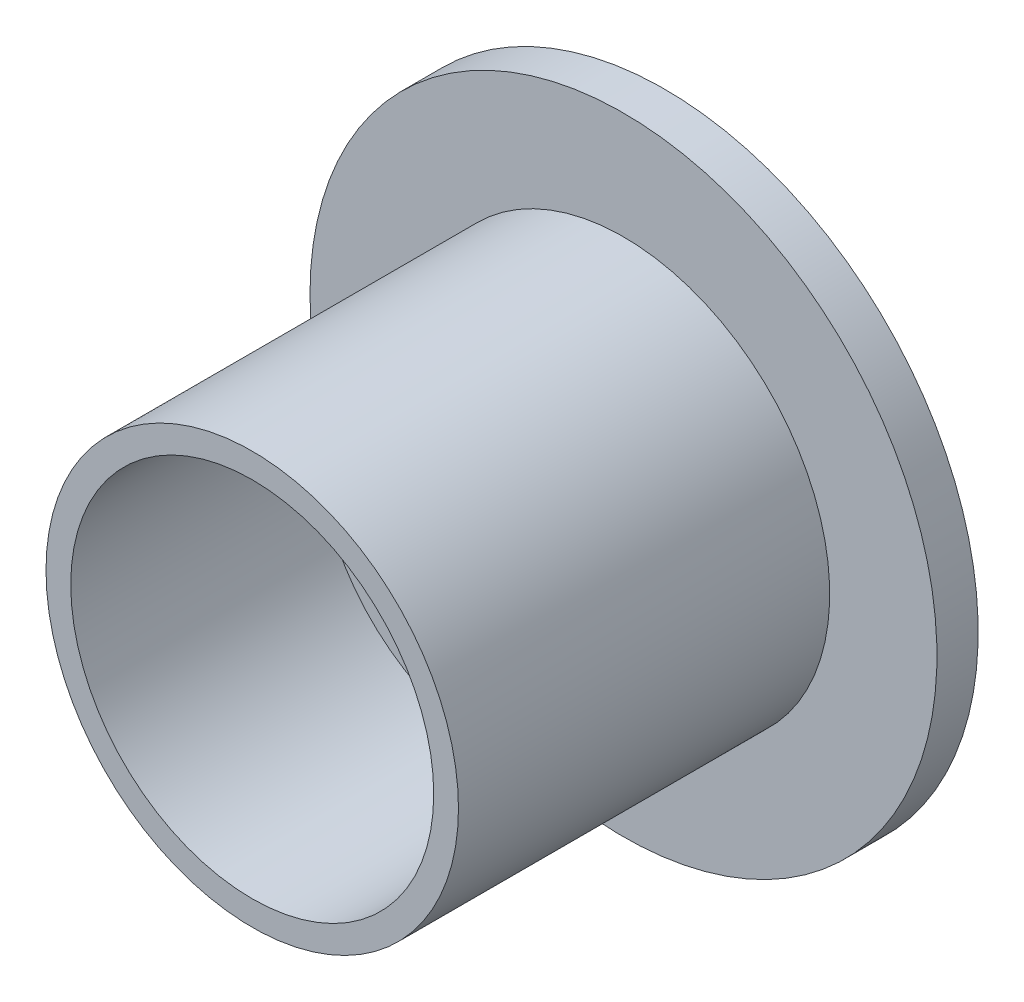
ISO-10303-21;
HEADER;
FILE_DESCRIPTION(('STEP AP214'),'2;1');
FILE_NAME('part.step','',(''),(''),'','','');
FILE_SCHEMA(('AUTOMOTIVE_DESIGN { 1 0 10303 214 1 1 1 1 }'));
ENDSEC;
DATA;
#1=APPLICATION_CONTEXT('core data for automotive mechanical design processes');
#2=APPLICATION_PROTOCOL_DEFINITION('international standard','automotive_design',2000,#1);
#3=PRODUCT_CONTEXT('',#1,'mechanical');
#4=PRODUCT('Part','Part','',(#3));
#5=PRODUCT_RELATED_PRODUCT_CATEGORY('part','',(#4));
#6=PRODUCT_DEFINITION_FORMATION('','',#4);
#7=PRODUCT_DEFINITION_CONTEXT('part definition',#1,'design');
#8=PRODUCT_DEFINITION('design','',#6,#7);
#9=PRODUCT_DEFINITION_SHAPE('','',#8);
#10=(LENGTH_UNIT() NAMED_UNIT(*) SI_UNIT(.MILLI.,.METRE.));
#11=(NAMED_UNIT(*) PLANE_ANGLE_UNIT() SI_UNIT($,.RADIAN.));
#12=(NAMED_UNIT(*) SI_UNIT($,.STERADIAN.) SOLID_ANGLE_UNIT());
#13=UNCERTAINTY_MEASURE_WITH_UNIT(LENGTH_MEASURE(1.E-05),#10,'distance_accuracy_value','');
#14=(GEOMETRIC_REPRESENTATION_CONTEXT(3) GLOBAL_UNCERTAINTY_ASSIGNED_CONTEXT((#13)) GLOBAL_UNIT_ASSIGNED_CONTEXT((#10,
#11,#12)) REPRESENTATION_CONTEXT('',''));
#15=CARTESIAN_POINT('',(0.,0.,0.));
#16=DIRECTION('',(0.,0.,1.));
#17=DIRECTION('',(1.,0.,0.));
#18=AXIS2_PLACEMENT_3D('',#15,#16,#17);
#19=CARTESIAN_POINT('',(0.,0.,0.));
#20=DIRECTION('',(0.,0.,-1.));
#21=DIRECTION('',(-1.,0.,0.));
#22=AXIS2_PLACEMENT_3D('',#19,#20,#21);
#23=CONICAL_SURFACE('',#22,22.,0.0872664625997167);
#24=CARTESIAN_POINT('',(0.,0.,0.));
#25=DIRECTION('',(0.,0.,-1.));
#26=DIRECTION('',(-1.,0.,0.));
#27=AXIS2_PLACEMENT_3D('',#24,#25,#26);
#28=CIRCLE('',#27,22.);
#29=CARTESIAN_POINT('',(-22.,0.,0.));
#30=VERTEX_POINT('',#29);
#31=EDGE_CURVE('E51',#30,#30,#28,.T.);
#32=ORIENTED_EDGE('',*,*,#31,.T.);
#33=EDGE_LOOP('',(#32));
#34=FACE_BOUND('',#33,.T.);
#35=CARTESIAN_POINT('',(0.,0.,20.));
#36=DIRECTION('',(0.,0.,1.));
#37=DIRECTION('',(1.,0.,0.));
#38=AXIS2_PLACEMENT_3D('',#35,#36,#37);
#39=CIRCLE('',#38,20.2502267294815);
#40=CARTESIAN_POINT('',(20.2502267294815,0.,20.));
#41=VERTEX_POINT('',#40);
#42=EDGE_CURVE('E35',#41,#41,#39,.F.);
#43=ORIENTED_EDGE('',*,*,#42,.F.);
#44=EDGE_LOOP('',(#43));
#45=FACE_BOUND('',#44,.T.);
#46=ADVANCED_FACE('F31',(#34,#45),#23,.F.);
#47=CARTESIAN_POINT('',(0.,0.,50.));
#48=DIRECTION('',(0.,0.,-1.));
#49=DIRECTION('',(-1.,0.,0.));
#50=AXIS2_PLACEMENT_3D('',#47,#48,#49);
#51=CYLINDRICAL_SURFACE('',#50,25.);
#52=CARTESIAN_POINT('',(0.,0.,5.));
#53=DIRECTION('',(0.,0.,-1.));
#54=DIRECTION('',(-1.,0.,0.));
#55=AXIS2_PLACEMENT_3D('',#52,#53,#54);
#56=CIRCLE('',#55,25.);
#57=CARTESIAN_POINT('',(-25.,0.,5.));
#58=VERTEX_POINT('',#57);
#59=EDGE_CURVE('E39',#58,#58,#56,.T.);
#60=ORIENTED_EDGE('',*,*,#59,.F.);
#61=EDGE_LOOP('',(#60));
#62=FACE_BOUND('',#61,.T.);
#63=CARTESIAN_POINT('',(0.,0.,50.));
#64=DIRECTION('',(0.,0.,1.));
#65=DIRECTION('',(1.,0.,0.));
#66=AXIS2_PLACEMENT_3D('',#63,#64,#65);
#67=CIRCLE('',#66,25.);
#68=CARTESIAN_POINT('',(25.,0.,50.));
#69=VERTEX_POINT('',#68);
#70=EDGE_CURVE('E10',#69,#69,#67,.T.);
#71=ORIENTED_EDGE('',*,*,#70,.F.);
#72=EDGE_LOOP('',(#71));
#73=FACE_BOUND('',#72,.T.);
#74=ADVANCED_FACE('F33',(#62,#73),#51,.T.);
#75=CARTESIAN_POINT('',(0.,0.,50.));
#76=DIRECTION('',(0.,0.,1.));
#77=DIRECTION('',(1.,0.,0.));
#78=AXIS2_PLACEMENT_3D('',#75,#76,#77);
#79=PLANE('',#78);
#80=CARTESIAN_POINT('',(0.,0.,50.));
#81=DIRECTION('',(0.,0.,1.));
#82=DIRECTION('',(1.,0.,0.));
#83=AXIS2_PLACEMENT_3D('',#80,#81,#82);
#84=CIRCLE('',#83,22.);
#85=CARTESIAN_POINT('',(22.,0.,50.));
#86=VERTEX_POINT('',#85);
#87=EDGE_CURVE('E54',#86,#86,#84,.T.);
#88=ORIENTED_EDGE('',*,*,#87,.F.);
#89=EDGE_LOOP('',(#88));
#90=FACE_BOUND('',#89,.T.);
#91=ORIENTED_EDGE('',*,*,#70,.T.);
#92=EDGE_LOOP('',(#91));
#93=FACE_BOUND('',#92,.T.);
#94=ADVANCED_FACE('F72',(#90,#93),#79,.T.);
#95=CARTESIAN_POINT('',(0.,38.,5.));
#96=DIRECTION('',(0.,0.,1.));
#97=DIRECTION('',(1.,0.,0.));
#98=AXIS2_PLACEMENT_3D('',#95,#96,#97);
#99=PLANE('',#98);
#100=ORIENTED_EDGE('',*,*,#59,.T.);
#101=EDGE_LOOP('',(#100));
#102=FACE_BOUND('',#101,.T.);
#103=CARTESIAN_POINT('',(0.,0.,5.));
#104=DIRECTION('',(0.,0.,-1.));
#105=DIRECTION('',(-1.,0.,0.));
#106=AXIS2_PLACEMENT_3D('',#103,#104,#105);
#107=CIRCLE('',#106,38.);
#108=CARTESIAN_POINT('',(-38.,0.,5.));
#109=VERTEX_POINT('',#108);
#110=EDGE_CURVE('E43',#109,#109,#107,.T.);
#111=ORIENTED_EDGE('',*,*,#110,.F.);
#112=EDGE_LOOP('',(#111));
#113=FACE_BOUND('',#112,.T.);
#114=ADVANCED_FACE('F82',(#102,#113),#99,.T.);
#115=CARTESIAN_POINT('',(0.,0.,-2.5));
#116=DIRECTION('',(0.,0.,-1.));
#117=DIRECTION('',(-1.,0.,0.));
#118=AXIS2_PLACEMENT_3D('',#115,#116,#117);
#119=CYLINDRICAL_SURFACE('',#118,38.);
#120=ORIENTED_EDGE('',*,*,#110,.T.);
#121=EDGE_LOOP('',(#120));
#122=FACE_BOUND('',#121,.T.);
#123=CARTESIAN_POINT('',(0.,0.,0.));
#124=DIRECTION('',(0.,0.,-1.));
#125=DIRECTION('',(-1.,0.,0.));
#126=AXIS2_PLACEMENT_3D('',#123,#124,#125);
#127=CIRCLE('',#126,38.);
#128=CARTESIAN_POINT('',(-38.,0.,0.));
#129=VERTEX_POINT('',#128);
#130=EDGE_CURVE('E48',#129,#129,#127,.T.);
#131=ORIENTED_EDGE('',*,*,#130,.F.);
#132=EDGE_LOOP('',(#131));
#133=FACE_BOUND('',#132,.T.);
#134=ADVANCED_FACE('F78',(#122,#133),#119,.T.);
#135=CARTESIAN_POINT('',(0.,0.,0.));
#136=DIRECTION('',(0.,0.,1.));
#137=DIRECTION('',(1.,0.,0.));
#138=AXIS2_PLACEMENT_3D('',#135,#136,#137);
#139=PLANE('',#138);
#140=ORIENTED_EDGE('',*,*,#31,.F.);
#141=EDGE_LOOP('',(#140));
#142=FACE_BOUND('',#141,.T.);
#143=ORIENTED_EDGE('',*,*,#130,.T.);
#144=EDGE_LOOP('',(#143));
#145=FACE_BOUND('',#144,.T.);
#146=ADVANCED_FACE('F81',(#142,#145),#139,.F.);
#147=CARTESIAN_POINT('',(0.,0.,20.));
#148=DIRECTION('',(0.,0.,1.));
#149=DIRECTION('',(1.,0.,0.));
#150=AXIS2_PLACEMENT_3D('',#147,#148,#149);
#151=PLANE('',#150);
#152=CARTESIAN_POINT('',(0.,0.,20.));
#153=DIRECTION('',(0.,0.,1.));
#154=DIRECTION('',(1.,0.,0.));
#155=AXIS2_PLACEMENT_3D('',#152,#153,#154);
#156=CIRCLE('',#155,22.);
#157=CARTESIAN_POINT('',(22.,0.,20.));
#158=VERTEX_POINT('',#157);
#159=EDGE_CURVE('E57',#158,#158,#156,.T.);
#160=ORIENTED_EDGE('',*,*,#159,.T.);
#161=EDGE_LOOP('',(#160));
#162=FACE_BOUND('',#161,.T.);
#163=ORIENTED_EDGE('',*,*,#42,.T.);
#164=EDGE_LOOP('',(#163));
#165=FACE_BOUND('',#164,.T.);
#166=ADVANCED_FACE('F64',(#162,#165),#151,.T.);
#167=CARTESIAN_POINT('',(0.,0.,20.));
#168=DIRECTION('',(0.,0.,1.));
#169=DIRECTION('',(1.,0.,0.));
#170=AXIS2_PLACEMENT_3D('',#167,#168,#169);
#171=CYLINDRICAL_SURFACE('',#170,22.);
#172=ORIENTED_EDGE('',*,*,#159,.F.);
#173=EDGE_LOOP('',(#172));
#174=FACE_BOUND('',#173,.T.);
#175=ORIENTED_EDGE('',*,*,#87,.T.);
#176=EDGE_LOOP('',(#175));
#177=FACE_BOUND('',#176,.T.);
#178=ADVANCED_FACE('F76',(#174,#177),#171,.F.);
#179=CLOSED_SHELL('',(#46,#74,#94,#114,#134,#146,#166,#178));
#180=MANIFOLD_SOLID_BREP('B2',#179);
#181=ADVANCED_BREP_SHAPE_REPRESENTATION('',(#18,#180),#14);
#182=SHAPE_DEFINITION_REPRESENTATION(#9,#181);
ENDSEC;
END-ISO-10303-21;
